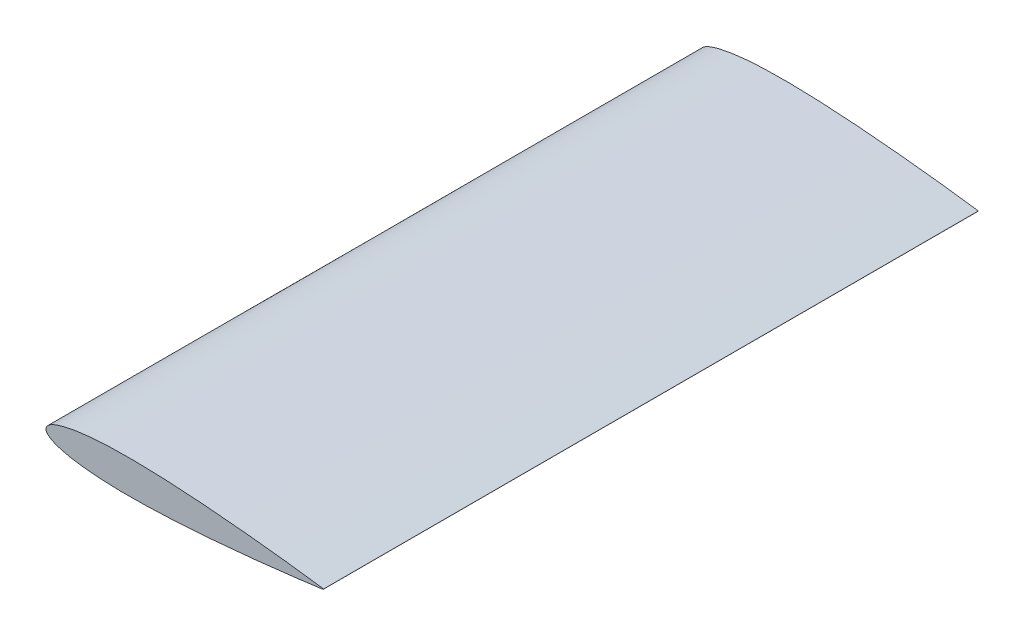
ISO-10303-21;
HEADER;
FILE_DESCRIPTION(('STEP AP214'),'2;1');
FILE_NAME('part.step','',(''),(''),'','','');
FILE_SCHEMA(('AUTOMOTIVE_DESIGN { 1 0 10303 214 1 1 1 1 }'));
ENDSEC;
DATA;
#1=APPLICATION_CONTEXT('core data for automotive mechanical design processes');
#2=APPLICATION_PROTOCOL_DEFINITION('international standard','automotive_design',2000,#1);
#3=PRODUCT_CONTEXT('',#1,'mechanical');
#4=PRODUCT('Part','Part','',(#3));
#5=PRODUCT_RELATED_PRODUCT_CATEGORY('part','',(#4));
#6=PRODUCT_DEFINITION_FORMATION('','',#4);
#7=PRODUCT_DEFINITION_CONTEXT('part definition',#1,'design');
#8=PRODUCT_DEFINITION('design','',#6,#7);
#9=PRODUCT_DEFINITION_SHAPE('','',#8);
#10=(LENGTH_UNIT() NAMED_UNIT(*) SI_UNIT(.MILLI.,.METRE.));
#11=(NAMED_UNIT(*) PLANE_ANGLE_UNIT() SI_UNIT($,.RADIAN.));
#12=(NAMED_UNIT(*) SI_UNIT($,.STERADIAN.) SOLID_ANGLE_UNIT());
#13=UNCERTAINTY_MEASURE_WITH_UNIT(LENGTH_MEASURE(1.E-05),#10,'distance_accuracy_value','');
#14=(GEOMETRIC_REPRESENTATION_CONTEXT(3) GLOBAL_UNCERTAINTY_ASSIGNED_CONTEXT((#13)) GLOBAL_UNIT_ASSIGNED_CONTEXT((#10,
#11,#12)) REPRESENTATION_CONTEXT('',''));
#15=CARTESIAN_POINT('',(0.,0.,0.));
#16=DIRECTION('',(0.,0.,1.));
#17=DIRECTION('',(1.,0.,0.));
#18=AXIS2_PLACEMENT_3D('',#15,#16,#17);
#19=CARTESIAN_POINT('',(-72.4895575679674,12.4916579430229,269.875));
#20=CARTESIAN_POINT('',(-72.4895575679674,12.1631799490064,269.875));
#21=CARTESIAN_POINT('',(-72.3954250237942,11.4893406700684,269.875));
#22=CARTESIAN_POINT('',(-71.9732287690968,10.5126102787401,269.875));
#23=CARTESIAN_POINT('',(-71.2833044842986,9.57257365715759,269.875));
#24=CARTESIAN_POINT('',(-70.3340272758223,8.66515080778666,269.875));
#25=CARTESIAN_POINT('',(-69.1284685897295,7.78715448902189,269.875));
#26=CARTESIAN_POINT('',(-67.6683837824737,6.93774581264716,269.875));
#27=CARTESIAN_POINT('',(-65.9559097036373,6.11788986682478,269.875));
#28=CARTESIAN_POINT('',(-63.9940826032224,5.32944509023976,269.875));
#29=CARTESIAN_POINT('',(-61.7867945135545,4.57475830238824,269.875));
#30=CARTESIAN_POINT('',(-59.3387565999433,3.85635785986425,269.875));
#31=CARTESIAN_POINT('',(-56.6553565640127,3.17695034396704,269.875));
#32=CARTESIAN_POINT('',(-53.7426855672555,2.53900219547483,269.875));
#33=CARTESIAN_POINT('',(-50.6073717613261,1.9451341049457,269.875));
#34=CARTESIAN_POINT('',(-47.2566631082039,1.39750679877092,269.875));
#35=CARTESIAN_POINT('',(-43.6982929093194,0.898367728586359,269.875));
#36=CARTESIAN_POINT('',(-39.9405377250841,0.44940196100295,269.875));
#37=CARTESIAN_POINT('',(-35.9921306676939,0.0522132030337248,269.875));
#38=CARTESIAN_POINT('',(-31.8622786169259,-0.292093371568796,269.875));
#39=CARTESIAN_POINT('',(-27.5606045907713,-0.582721331729668,269.875));
#40=CARTESIAN_POINT('',(-23.0971298056179,-0.819182723469344,269.875));
#41=CARTESIAN_POINT('',(-18.4822758984656,-1.00153037864844,269.875));
#42=CARTESIAN_POINT('',(-13.7268174183502,-1.1301051812941,269.875));
#43=CARTESIAN_POINT('',(-8.8418522389767,-1.20560971573803,269.875));
#44=CARTESIAN_POINT('',(-3.83877739522492,-1.22921281678125,269.875));
#45=CARTESIAN_POINT('',(1.2707219456733,-1.20232588850451,269.875));
#46=CARTESIAN_POINT('',(6.47471549135035,-1.12670718813807,269.875));
#47=CARTESIAN_POINT('',(11.7610520830332,-1.00440567889788,269.875));
#48=CARTESIAN_POINT('',(17.117399344137,-0.837746181545105,269.875));
#49=CARTESIAN_POINT('',(22.5312466579631,-0.629162896081708,269.875));
#50=CARTESIAN_POINT('',(27.989948369281,-0.381339327113552,269.875));
#51=CARTESIAN_POINT('',(33.4807602973594,-0.0970883226520112,269.875));
#52=CARTESIAN_POINT('',(38.9908674308872,0.220726475530346,269.875));
#53=CARTESIAN_POINT('',(44.5074030856521,0.569152493842438,269.875));
#54=CARTESIAN_POINT('',(50.0174841301867,0.945227026758529,269.875));
#55=CARTESIAN_POINT('',(55.5082484798003,1.34599734481427,269.875));
#56=CARTESIAN_POINT('',(60.966870643492,1.76845936690057,269.875));
#57=CARTESIAN_POINT('',(66.3806056488603,2.20978619117466,269.875));
#58=CARTESIAN_POINT('',(71.73680094619,2.66709489859545,269.875));
#59=CARTESIAN_POINT('',(77.022966890695,3.13761381624091,269.875));
#60=CARTESIAN_POINT('',(82.2267422325146,3.61863732712787,269.875));
#61=CARTESIAN_POINT('',(87.3359862787904,4.10746603783953,269.875));
#62=CARTESIAN_POINT('',(92.3387492897865,4.60161240089001,269.875));
#63=CARTESIAN_POINT('',(97.2233704395626,5.09850974509125,269.875));
#64=CARTESIAN_POINT('',(101.978420579536,5.59574213510781,269.875));
#65=CARTESIAN_POINT('',(106.592806112693,6.09086461033472,269.875));
#66=CARTESIAN_POINT('',(111.055740440689,6.58146851328092,269.875));
#67=CARTESIAN_POINT('',(115.356796488438,7.06535562200448,269.875));
#68=CARTESIAN_POINT('',(119.485946028976,7.54006714693968,269.875));
#69=CARTESIAN_POINT('',(123.433537168402,8.00339554541148,269.875));
#70=CARTESIAN_POINT('',(127.190349685259,8.45306443030988,269.875));
#71=CARTESIAN_POINT('',(130.747598759962,8.88685815975099,269.875));
#72=CARTESIAN_POINT('',(134.096991184743,9.30250286390473,269.875));
#73=CARTESIAN_POINT('',(137.230695420591,9.69790302694453,269.875));
#74=CARTESIAN_POINT('',(140.141398454237,10.0708470797437,269.875));
#75=CARTESIAN_POINT('',(142.822290249236,10.4194168887949,269.875));
#76=CARTESIAN_POINT('',(145.267118152254,10.7414893081718,269.875));
#77=CARTESIAN_POINT('',(147.470194704161,11.0352743430091,269.875));
#78=CARTESIAN_POINT('',(149.426288025842,11.299112749374,269.875));
#79=CARTESIAN_POINT('',(151.131108503296,11.5308673214838,269.875));
#80=CARTESIAN_POINT('',(152.579838285708,11.7307823466118,269.875));
#81=CARTESIAN_POINT('',(153.771480414837,11.8926741562028,269.875));
#82=CARTESIAN_POINT('',(154.69687642952,12.0287252392023,269.875));
#83=CARTESIAN_POINT('',(155.369349102873,12.1059141280244,269.875));
#84=CARTESIAN_POINT('',(155.755667825148,12.1894433999598,269.875));
#85=CARTESIAN_POINT('',(156.151924325214,12.1818945605116,269.875));
#86=CARTESIAN_POINT('',(156.151924325213,12.8014213255342,269.875));
#87=CARTESIAN_POINT('',(155.755667825148,12.793872486086,269.875));
#88=CARTESIAN_POINT('',(155.369349102873,12.8774017580214,269.875));
#89=CARTESIAN_POINT('',(154.69687642952,12.9545906468436,269.875));
#90=CARTESIAN_POINT('',(153.771480414837,13.0906417298431,269.875));
#91=CARTESIAN_POINT('',(152.579838285709,13.252533539434,269.875));
#92=CARTESIAN_POINT('',(151.131108503296,13.452448564562,269.875));
#93=CARTESIAN_POINT('',(149.426288025842,13.6842031366718,269.875));
#94=CARTESIAN_POINT('',(147.470194704161,13.9480415430367,269.875));
#95=CARTESIAN_POINT('',(145.267118152254,14.241826577874,269.875));
#96=CARTESIAN_POINT('',(142.822290249236,14.5638989972509,269.875));
#97=CARTESIAN_POINT('',(140.141398454237,14.9124688063022,269.875));
#98=CARTESIAN_POINT('',(137.230695420591,15.2854128591013,269.875));
#99=CARTESIAN_POINT('',(134.096991184743,15.6808130221411,269.875));
#100=CARTESIAN_POINT('',(130.747598759962,16.0964577262948,269.875));
#101=CARTESIAN_POINT('',(127.190349685259,16.530251455736,269.875));
#102=CARTESIAN_POINT('',(123.433537168402,16.9799203406344,269.875));
#103=CARTESIAN_POINT('',(119.485946028976,17.4432487391061,269.875));
#104=CARTESIAN_POINT('',(115.356796488438,17.9179602640414,269.875));
#105=CARTESIAN_POINT('',(111.055740440688,18.4018473727649,269.875));
#106=CARTESIAN_POINT('',(106.592806112694,18.8924512757111,269.875));
#107=CARTESIAN_POINT('',(101.978420579536,19.387573750938,269.875));
#108=CARTESIAN_POINT('',(97.2233704395625,19.8848061409546,269.875));
#109=CARTESIAN_POINT('',(92.3387492897866,20.3817034851558,269.875));
#110=CARTESIAN_POINT('',(87.3359862787904,20.8758498482063,269.875));
#111=CARTESIAN_POINT('',(82.2267422325146,21.364678558918,269.875));
#112=CARTESIAN_POINT('',(77.022966890695,21.8457020698049,269.875));
#113=CARTESIAN_POINT('',(71.73680094619,22.3162209874504,269.875));
#114=CARTESIAN_POINT('',(66.3806056488603,22.7735296948712,269.875));
#115=CARTESIAN_POINT('',(60.9668706434919,23.2148565191453,269.875));
#116=CARTESIAN_POINT('',(55.5082484798003,23.6373185412316,269.875));
#117=CARTESIAN_POINT('',(50.0174841301867,24.0380888592873,269.875));
#118=CARTESIAN_POINT('',(44.5074030856521,24.4141633922034,269.875));
#119=CARTESIAN_POINT('',(38.9908674308871,24.7625894105155,269.875));
#120=CARTESIAN_POINT('',(33.4807602973595,25.0804042086978,269.875));
#121=CARTESIAN_POINT('',(27.9899483692809,25.3646552131594,269.875));
#122=CARTESIAN_POINT('',(22.5312466579631,25.6124787821275,269.875));
#123=CARTESIAN_POINT('',(17.117399344137,25.8210620675909,269.875));
#124=CARTESIAN_POINT('',(11.7610520830332,25.9877215649437,269.875));
#125=CARTESIAN_POINT('',(6.47471549135035,26.1100230741839,269.875));
#126=CARTESIAN_POINT('',(1.27072194567333,26.1856417745503,269.875));
#127=CARTESIAN_POINT('',(-3.83877739522493,26.2125287028271,269.875));
#128=CARTESIAN_POINT('',(-8.84185223897671,26.1889256017839,269.875));
#129=CARTESIAN_POINT('',(-13.7268174183502,26.1134210673399,269.875));
#130=CARTESIAN_POINT('',(-18.4822758984657,25.9848462646943,269.875));
#131=CARTESIAN_POINT('',(-23.0971298056178,25.8024986095152,269.875));
#132=CARTESIAN_POINT('',(-27.5606045907713,25.5660372177755,269.875));
#133=CARTESIAN_POINT('',(-31.8622786169259,25.2754092576146,269.875));
#134=CARTESIAN_POINT('',(-35.9921306676939,24.9311026830121,269.875));
#135=CARTESIAN_POINT('',(-39.9405377250841,24.5339139250429,269.875));
#136=CARTESIAN_POINT('',(-43.6982929093194,24.0849481574595,269.875));
#137=CARTESIAN_POINT('',(-47.2566631082038,23.5858090872749,269.875));
#138=CARTESIAN_POINT('',(-50.6073717613261,23.0381817811001,269.875));
#139=CARTESIAN_POINT('',(-53.7426855672555,22.444313690571,269.875));
#140=CARTESIAN_POINT('',(-56.6553565640127,21.8063655420788,269.875));
#141=CARTESIAN_POINT('',(-59.3387565999433,21.1269580261816,269.875));
#142=CARTESIAN_POINT('',(-61.7867945135545,20.4085575836576,269.875));
#143=CARTESIAN_POINT('',(-63.9940826032224,19.6538707958061,269.875));
#144=CARTESIAN_POINT('',(-65.9559097036373,18.865426019221,269.875));
#145=CARTESIAN_POINT('',(-67.6683837824737,18.0455700733987,269.875));
#146=CARTESIAN_POINT('',(-69.1284685897295,17.1961613970239,269.875));
#147=CARTESIAN_POINT('',(-70.3340272758223,16.3181650782592,269.875));
#148=CARTESIAN_POINT('',(-71.2833044842987,15.4107422288882,269.875));
#149=CARTESIAN_POINT('',(-71.9732287690968,14.4707056073057,269.875));
#150=CARTESIAN_POINT('',(-72.3954250237942,13.4939752159774,269.875));
#151=CARTESIAN_POINT('',(-72.4895575679674,12.8201359370394,269.875));
#152=CARTESIAN_POINT('',(-72.4895575679674,12.4916579430229,269.875));
#153=B_SPLINE_CURVE_WITH_KNOTS('',3,(#19,#20,#21,#22,#23,#24,#25,#26,#27,#28,#29,#30,#31,#32,
#33,#34,#35,#36,#37,#38,#39,#40,#41,#42,#43,#44,#45,#46,#47,#48,#49,#50,#51,#52,#53,#54,#55,#56,
#57,#58,#59,#60,#61,#62,#63,#64,#65,#66,#67,#68,#69,#70,#71,#72,#73,#74,#75,#76,#77,#78,#79,#80,
#81,#82,#83,#84,#85,#86,#87,#88,#89,#90,#91,#92,#93,#94,#95,#96,#97,#98,#99,#100,#101,#102,#103,
#104,#105,#106,#107,#108,#109,#110,#111,#112,#113,#114,#115,#116,#117,#118,#119,#120,#121,#122,
#123,#124,#125,#126,#127,#128,#129,#130,#131,#132,#133,#134,#135,#136,#137,#138,#139,#140,#141,
#142,#143,#144,#145,#146,#147,#148,#149,#150,#151,#152),.UNSPECIFIED.,.T.,.F.,(4,1,1,1,1,1,1,1,
1,1,1,1,1,1,1,1,1,1,1,1,1,1,1,1,1,1,1,1,1,1,1,1,1,1,1,1,1,1,1,1,1,1,1,1,1,1,1,1,1,1,1,1,1,1,1,1,
1,1,1,1,1,1,1,1,1,1,1,1,1,1,1,1,1,1,1,1,1,1,1,1,1,1,1,1,1,1,1,1,1,1,1,1,1,1,1,1,1,1,1,1,1,1,1,1,
1,1,1,1,1,1,1,1,1,1,1,1,1,1,1,1,1,1,1,1,1,1,1,1,1,1,1,4),(0.,0.00210616807074115,
0.00432059011551111,0.00677278324255004,0.0095566969740557,0.0127340412762951,0.016342887665016,
0.0204056041416188,0.0249341021959062,0.0299330711387399,0.0354022405625184,0.0413374297387623,
0.0477315899593609,0.0545753893368606,0.0618574049639954,0.0695645708943233,0.0776823107915671,
0.0861946839628209,0.0950844406286816,0.104333244082668,0.11392170016525,0.123829338817381,
0.134034707587743,0.144515530837606,0.155248716244455,0.166210355911424,0.177375782785101,
0.188719821086083,0.200216647190567,0.211839950659802,0.223562989450439,0.235358652726913,
0.247199624742581,0.259058395239763,0.270907226000352,0.28271845684065,0.294464514017973,
0.306117689175103,0.317650770640405,0.329036618137891,0.340248510387813,0.351259999107984,
0.362045273287995,0.372578891011839,0.382836142378724,0.392792739452293,0.402425320157517,
0.411711114815343,0.420628244391039,0.429155672678663,0.437273179489273,0.444961560956889,
0.452202574975458,0.458979062595132,0.465274875652064,0.471074962819879,0.4763655692602,
0.481133960582339,0.485368767772863,0.489059784178549,0.492198147958178,0.494776266124308,
0.496788010026555,0.49822842540793,0.499094072926926,0.499382862053181,0.500617137946819,
0.500905927073075,0.50177157459207,0.503211989973446,0.505223733875692,0.507801852041822,
0.510940215821451,0.514631232227138,0.518866039417661,0.5236344307398,0.528925037180122,
0.534725124347937,0.541020937404868,0.547797425024542,0.555038439043111,0.562726820510727,
0.570844327321338,0.579371755608962,0.588288885184657,0.597574679842483,0.607207260547707,
0.617163857621276,0.627421108988161,0.637954726712006,0.648740000892016,0.659751489612187,
0.670963381862109,0.682349229359595,0.693882310824897,0.705535485982027,0.717281543159351,
0.729092773999648,0.740941604760238,0.752800375257419,0.764641347273087,0.776437010549561,
0.788160049340198,0.799783352809433,0.811280178913917,0.822624217214899,0.833789644088576,
0.844751283755546,0.855484469162394,0.865965292412258,0.876170661182619,0.88607829983475,
0.895666755917333,0.904915559371319,0.913805316037179,0.922317689208433,0.930435429105677,
0.938142595036005,0.94542461066314,0.952268410040639,0.958662570261238,0.964597759437482,
0.97006692886126,0.975065897804094,0.979594395858381,0.983657112334984,0.987265958723705,
0.990443303025944,0.99322721675745,0.995679409884489,0.997893831929259,1.),.UNSPECIFIED.);
#154=DIRECTION('',(0.,0.,-1.));
#155=VECTOR('',#154,1.);
#156=SURFACE_OF_LINEAR_EXTRUSION('',#153,#155);
#157=CARTESIAN_POINT('',(-72.4895575679674,12.4916579430229,269.875));
#158=VERTEX_POINT('',#157);
#159=EDGE_CURVE('E10',#158,#158,#153,.T.);
#160=ORIENTED_EDGE('',*,*,#159,.F.);
#161=EDGE_LOOP('',(#160));
#162=FACE_BOUND('',#161,.T.);
#163=CARTESIAN_POINT('',(-72.4895575679674,12.4916579430229,-269.875));
#164=CARTESIAN_POINT('',(-72.4895575679674,12.1631799490064,-269.875));
#165=CARTESIAN_POINT('',(-72.3954250237942,11.4893406700684,-269.875));
#166=CARTESIAN_POINT('',(-71.9732287690968,10.5126102787401,-269.875));
#167=CARTESIAN_POINT('',(-71.2833044842986,9.57257365715759,-269.875));
#168=CARTESIAN_POINT('',(-70.3340272758223,8.66515080778666,-269.875));
#169=CARTESIAN_POINT('',(-69.1284685897295,7.78715448902189,-269.875));
#170=CARTESIAN_POINT('',(-67.6683837824737,6.93774581264716,-269.875));
#171=CARTESIAN_POINT('',(-65.9559097036373,6.11788986682478,-269.875));
#172=CARTESIAN_POINT('',(-63.9940826032224,5.32944509023976,-269.875));
#173=CARTESIAN_POINT('',(-61.7867945135545,4.57475830238824,-269.875));
#174=CARTESIAN_POINT('',(-59.3387565999433,3.85635785986425,-269.875));
#175=CARTESIAN_POINT('',(-56.6553565640127,3.17695034396704,-269.875));
#176=CARTESIAN_POINT('',(-53.7426855672555,2.53900219547483,-269.875));
#177=CARTESIAN_POINT('',(-50.6073717613261,1.9451341049457,-269.875));
#178=CARTESIAN_POINT('',(-47.2566631082039,1.39750679877092,-269.875));
#179=CARTESIAN_POINT('',(-43.6982929093194,0.898367728586359,-269.875));
#180=CARTESIAN_POINT('',(-39.9405377250841,0.44940196100295,-269.875));
#181=CARTESIAN_POINT('',(-35.9921306676939,0.0522132030337248,-269.875));
#182=CARTESIAN_POINT('',(-31.8622786169259,-0.292093371568796,-269.875));
#183=CARTESIAN_POINT('',(-27.5606045907713,-0.582721331729668,-269.875));
#184=CARTESIAN_POINT('',(-23.0971298056179,-0.819182723469344,-269.875));
#185=CARTESIAN_POINT('',(-18.4822758984656,-1.00153037864844,-269.875));
#186=CARTESIAN_POINT('',(-13.7268174183502,-1.1301051812941,-269.875));
#187=CARTESIAN_POINT('',(-8.8418522389767,-1.20560971573803,-269.875));
#188=CARTESIAN_POINT('',(-3.83877739522492,-1.22921281678125,-269.875));
#189=CARTESIAN_POINT('',(1.2707219456733,-1.20232588850451,-269.875));
#190=CARTESIAN_POINT('',(6.47471549135035,-1.12670718813807,-269.875));
#191=CARTESIAN_POINT('',(11.7610520830332,-1.00440567889788,-269.875));
#192=CARTESIAN_POINT('',(17.117399344137,-0.837746181545105,-269.875));
#193=CARTESIAN_POINT('',(22.5312466579631,-0.629162896081708,-269.875));
#194=CARTESIAN_POINT('',(27.989948369281,-0.381339327113552,-269.875));
#195=CARTESIAN_POINT('',(33.4807602973594,-0.0970883226520112,-269.875));
#196=CARTESIAN_POINT('',(38.9908674308872,0.220726475530346,-269.875));
#197=CARTESIAN_POINT('',(44.5074030856521,0.569152493842438,-269.875));
#198=CARTESIAN_POINT('',(50.0174841301867,0.945227026758529,-269.875));
#199=CARTESIAN_POINT('',(55.5082484798003,1.34599734481427,-269.875));
#200=CARTESIAN_POINT('',(60.966870643492,1.76845936690057,-269.875));
#201=CARTESIAN_POINT('',(66.3806056488603,2.20978619117466,-269.875));
#202=CARTESIAN_POINT('',(71.73680094619,2.66709489859545,-269.875));
#203=CARTESIAN_POINT('',(77.022966890695,3.13761381624091,-269.875));
#204=CARTESIAN_POINT('',(82.2267422325146,3.61863732712787,-269.875));
#205=CARTESIAN_POINT('',(87.3359862787904,4.10746603783953,-269.875));
#206=CARTESIAN_POINT('',(92.3387492897865,4.60161240089001,-269.875));
#207=CARTESIAN_POINT('',(97.2233704395626,5.09850974509125,-269.875));
#208=CARTESIAN_POINT('',(101.978420579536,5.59574213510781,-269.875));
#209=CARTESIAN_POINT('',(106.592806112693,6.09086461033472,-269.875));
#210=CARTESIAN_POINT('',(111.055740440689,6.58146851328092,-269.875));
#211=CARTESIAN_POINT('',(115.356796488438,7.06535562200448,-269.875));
#212=CARTESIAN_POINT('',(119.485946028976,7.54006714693968,-269.875));
#213=CARTESIAN_POINT('',(123.433537168402,8.00339554541148,-269.875));
#214=CARTESIAN_POINT('',(127.190349685259,8.45306443030988,-269.875));
#215=CARTESIAN_POINT('',(130.747598759962,8.88685815975099,-269.875));
#216=CARTESIAN_POINT('',(134.096991184743,9.30250286390473,-269.875));
#217=CARTESIAN_POINT('',(137.230695420591,9.69790302694453,-269.875));
#218=CARTESIAN_POINT('',(140.141398454237,10.0708470797437,-269.875));
#219=CARTESIAN_POINT('',(142.822290249236,10.4194168887949,-269.875));
#220=CARTESIAN_POINT('',(145.267118152254,10.7414893081718,-269.875));
#221=CARTESIAN_POINT('',(147.470194704161,11.0352743430091,-269.875));
#222=CARTESIAN_POINT('',(149.426288025842,11.299112749374,-269.875));
#223=CARTESIAN_POINT('',(151.131108503296,11.5308673214838,-269.875));
#224=CARTESIAN_POINT('',(152.579838285708,11.7307823466118,-269.875));
#225=CARTESIAN_POINT('',(153.771480414837,11.8926741562028,-269.875));
#226=CARTESIAN_POINT('',(154.69687642952,12.0287252392023,-269.875));
#227=CARTESIAN_POINT('',(155.369349102873,12.1059141280244,-269.875));
#228=CARTESIAN_POINT('',(155.755667825148,12.1894433999598,-269.875));
#229=CARTESIAN_POINT('',(156.151924325214,12.1818945605116,-269.875));
#230=CARTESIAN_POINT('',(156.151924325213,12.8014213255342,-269.875));
#231=CARTESIAN_POINT('',(155.755667825148,12.793872486086,-269.875));
#232=CARTESIAN_POINT('',(155.369349102873,12.8774017580214,-269.875));
#233=CARTESIAN_POINT('',(154.69687642952,12.9545906468436,-269.875));
#234=CARTESIAN_POINT('',(153.771480414837,13.0906417298431,-269.875));
#235=CARTESIAN_POINT('',(152.579838285709,13.252533539434,-269.875));
#236=CARTESIAN_POINT('',(151.131108503296,13.452448564562,-269.875));
#237=CARTESIAN_POINT('',(149.426288025842,13.6842031366718,-269.875));
#238=CARTESIAN_POINT('',(147.470194704161,13.9480415430367,-269.875));
#239=CARTESIAN_POINT('',(145.267118152254,14.241826577874,-269.875));
#240=CARTESIAN_POINT('',(142.822290249236,14.5638989972509,-269.875));
#241=CARTESIAN_POINT('',(140.141398454237,14.9124688063022,-269.875));
#242=CARTESIAN_POINT('',(137.230695420591,15.2854128591013,-269.875));
#243=CARTESIAN_POINT('',(134.096991184743,15.6808130221411,-269.875));
#244=CARTESIAN_POINT('',(130.747598759962,16.0964577262948,-269.875));
#245=CARTESIAN_POINT('',(127.190349685259,16.530251455736,-269.875));
#246=CARTESIAN_POINT('',(123.433537168402,16.9799203406344,-269.875));
#247=CARTESIAN_POINT('',(119.485946028976,17.4432487391061,-269.875));
#248=CARTESIAN_POINT('',(115.356796488438,17.9179602640414,-269.875));
#249=CARTESIAN_POINT('',(111.055740440688,18.4018473727649,-269.875));
#250=CARTESIAN_POINT('',(106.592806112694,18.8924512757111,-269.875));
#251=CARTESIAN_POINT('',(101.978420579536,19.387573750938,-269.875));
#252=CARTESIAN_POINT('',(97.2233704395625,19.8848061409546,-269.875));
#253=CARTESIAN_POINT('',(92.3387492897866,20.3817034851558,-269.875));
#254=CARTESIAN_POINT('',(87.3359862787904,20.8758498482063,-269.875));
#255=CARTESIAN_POINT('',(82.2267422325146,21.364678558918,-269.875));
#256=CARTESIAN_POINT('',(77.022966890695,21.8457020698049,-269.875));
#257=CARTESIAN_POINT('',(71.73680094619,22.3162209874504,-269.875));
#258=CARTESIAN_POINT('',(66.3806056488603,22.7735296948712,-269.875));
#259=CARTESIAN_POINT('',(60.9668706434919,23.2148565191453,-269.875));
#260=CARTESIAN_POINT('',(55.5082484798003,23.6373185412316,-269.875));
#261=CARTESIAN_POINT('',(50.0174841301867,24.0380888592873,-269.875));
#262=CARTESIAN_POINT('',(44.5074030856521,24.4141633922034,-269.875));
#263=CARTESIAN_POINT('',(38.9908674308871,24.7625894105155,-269.875));
#264=CARTESIAN_POINT('',(33.4807602973595,25.0804042086978,-269.875));
#265=CARTESIAN_POINT('',(27.9899483692809,25.3646552131594,-269.875));
#266=CARTESIAN_POINT('',(22.5312466579631,25.6124787821275,-269.875));
#267=CARTESIAN_POINT('',(17.117399344137,25.8210620675909,-269.875));
#268=CARTESIAN_POINT('',(11.7610520830332,25.9877215649437,-269.875));
#269=CARTESIAN_POINT('',(6.47471549135035,26.1100230741839,-269.875));
#270=CARTESIAN_POINT('',(1.27072194567333,26.1856417745503,-269.875));
#271=CARTESIAN_POINT('',(-3.83877739522493,26.2125287028271,-269.875));
#272=CARTESIAN_POINT('',(-8.84185223897671,26.1889256017839,-269.875));
#273=CARTESIAN_POINT('',(-13.7268174183502,26.1134210673399,-269.875));
#274=CARTESIAN_POINT('',(-18.4822758984657,25.9848462646943,-269.875));
#275=CARTESIAN_POINT('',(-23.0971298056178,25.8024986095152,-269.875));
#276=CARTESIAN_POINT('',(-27.5606045907713,25.5660372177755,-269.875));
#277=CARTESIAN_POINT('',(-31.8622786169259,25.2754092576146,-269.875));
#278=CARTESIAN_POINT('',(-35.9921306676939,24.9311026830121,-269.875));
#279=CARTESIAN_POINT('',(-39.9405377250841,24.5339139250429,-269.875));
#280=CARTESIAN_POINT('',(-43.6982929093194,24.0849481574595,-269.875));
#281=CARTESIAN_POINT('',(-47.2566631082038,23.5858090872749,-269.875));
#282=CARTESIAN_POINT('',(-50.6073717613261,23.0381817811001,-269.875));
#283=CARTESIAN_POINT('',(-53.7426855672555,22.444313690571,-269.875));
#284=CARTESIAN_POINT('',(-56.6553565640127,21.8063655420788,-269.875));
#285=CARTESIAN_POINT('',(-59.3387565999433,21.1269580261816,-269.875));
#286=CARTESIAN_POINT('',(-61.7867945135545,20.4085575836576,-269.875));
#287=CARTESIAN_POINT('',(-63.9940826032224,19.6538707958061,-269.875));
#288=CARTESIAN_POINT('',(-65.9559097036373,18.865426019221,-269.875));
#289=CARTESIAN_POINT('',(-67.6683837824737,18.0455700733987,-269.875));
#290=CARTESIAN_POINT('',(-69.1284685897295,17.1961613970239,-269.875));
#291=CARTESIAN_POINT('',(-70.3340272758223,16.3181650782592,-269.875));
#292=CARTESIAN_POINT('',(-71.2833044842987,15.4107422288882,-269.875));
#293=CARTESIAN_POINT('',(-71.9732287690968,14.4707056073057,-269.875));
#294=CARTESIAN_POINT('',(-72.3954250237942,13.4939752159774,-269.875));
#295=CARTESIAN_POINT('',(-72.4895575679674,12.8201359370394,-269.875));
#296=CARTESIAN_POINT('',(-72.4895575679674,12.4916579430229,-269.875));
#297=B_SPLINE_CURVE_WITH_KNOTS('',3,(#163,#164,#165,#166,#167,#168,#169,#170,#171,#172,#173,
#174,#175,#176,#177,#178,#179,#180,#181,#182,#183,#184,#185,#186,#187,#188,#189,#190,#191,#192,
#193,#194,#195,#196,#197,#198,#199,#200,#201,#202,#203,#204,#205,#206,#207,#208,#209,#210,#211,
#212,#213,#214,#215,#216,#217,#218,#219,#220,#221,#222,#223,#224,#225,#226,#227,#228,#229,#230,
#231,#232,#233,#234,#235,#236,#237,#238,#239,#240,#241,#242,#243,#244,#245,#246,#247,#248,#249,
#250,#251,#252,#253,#254,#255,#256,#257,#258,#259,#260,#261,#262,#263,#264,#265,#266,#267,#268,
#269,#270,#271,#272,#273,#274,#275,#276,#277,#278,#279,#280,#281,#282,#283,#284,#285,#286,#287,
#288,#289,#290,#291,#292,#293,#294,#295,#296),.UNSPECIFIED.,.T.,.F.,(4,1,1,1,1,1,1,1,1,1,1,1,1,
1,1,1,1,1,1,1,1,1,1,1,1,1,1,1,1,1,1,1,1,1,1,1,1,1,1,1,1,1,1,1,1,1,1,1,1,1,1,1,1,1,1,1,1,1,1,1,1,
1,1,1,1,1,1,1,1,1,1,1,1,1,1,1,1,1,1,1,1,1,1,1,1,1,1,1,1,1,1,1,1,1,1,1,1,1,1,1,1,1,1,1,1,1,1,1,1,
1,1,1,1,1,1,1,1,1,1,1,1,1,1,1,1,1,1,1,1,1,1,4),(0.,0.00210616807074115,0.00432059011551111,
0.00677278324255004,0.0095566969740557,0.0127340412762951,0.016342887665016,0.0204056041416188,
0.0249341021959062,0.0299330711387399,0.0354022405625184,0.0413374297387623,0.0477315899593609,
0.0545753893368606,0.0618574049639954,0.0695645708943233,0.0776823107915671,0.0861946839628209,
0.0950844406286816,0.104333244082668,0.11392170016525,0.123829338817381,0.134034707587743,
0.144515530837606,0.155248716244455,0.166210355911424,0.177375782785101,0.188719821086083,
0.200216647190567,0.211839950659802,0.223562989450439,0.235358652726913,0.247199624742581,
0.259058395239763,0.270907226000352,0.28271845684065,0.294464514017973,0.306117689175103,
0.317650770640405,0.329036618137891,0.340248510387813,0.351259999107984,0.362045273287995,
0.372578891011839,0.382836142378724,0.392792739452293,0.402425320157517,0.411711114815343,
0.420628244391039,0.429155672678663,0.437273179489273,0.444961560956889,0.452202574975458,
0.458979062595132,0.465274875652064,0.471074962819879,0.4763655692602,0.481133960582339,
0.485368767772863,0.489059784178549,0.492198147958178,0.494776266124308,0.496788010026555,
0.49822842540793,0.499094072926926,0.499382862053181,0.500617137946819,0.500905927073075,
0.50177157459207,0.503211989973446,0.505223733875692,0.507801852041822,0.510940215821451,
0.514631232227138,0.518866039417661,0.5236344307398,0.528925037180122,0.534725124347937,
0.541020937404868,0.547797425024542,0.555038439043111,0.562726820510727,0.570844327321338,
0.579371755608962,0.588288885184657,0.597574679842483,0.607207260547707,0.617163857621276,
0.627421108988161,0.637954726712006,0.648740000892016,0.659751489612187,0.670963381862109,
0.682349229359595,0.693882310824897,0.705535485982027,0.717281543159351,0.729092773999648,
0.740941604760238,0.752800375257419,0.764641347273087,0.776437010549561,0.788160049340198,
0.799783352809433,0.811280178913917,0.822624217214899,0.833789644088576,0.844751283755546,
0.855484469162394,0.865965292412258,0.876170661182619,0.88607829983475,0.895666755917333,
0.904915559371319,0.913805316037179,0.922317689208433,0.930435429105677,0.938142595036005,
0.94542461066314,0.952268410040639,0.958662570261238,0.964597759437482,0.97006692886126,
0.975065897804094,0.979594395858381,0.983657112334984,0.987265958723705,0.990443303025944,
0.99322721675745,0.995679409884489,0.997893831929259,1.),.UNSPECIFIED.);
#298=CARTESIAN_POINT('',(-72.4895575679674,12.4916579430229,-269.875));
#299=VERTEX_POINT('',#298);
#300=EDGE_CURVE('E49',#299,#299,#297,.T.);
#301=ORIENTED_EDGE('',*,*,#300,.T.);
#302=EDGE_LOOP('',(#301));
#303=FACE_BOUND('',#302,.T.);
#304=ADVANCED_FACE('F39',(#162,#303),#156,.F.);
#305=CARTESIAN_POINT('',(156.110442432033,12.4916579430228,269.875));
#306=DIRECTION('',(0.,0.,-1.));
#307=DIRECTION('',(-1.,0.,0.));
#308=AXIS2_PLACEMENT_3D('',#305,#306,#307);
#309=PLANE('',#308);
#310=ORIENTED_EDGE('',*,*,#159,.T.);
#311=EDGE_LOOP('',(#310));
#312=FACE_BOUND('',#311,.T.);
#313=ADVANCED_FACE('F64',(#312),#309,.F.);
#314=CARTESIAN_POINT('',(156.110442432033,12.4916579430228,-269.875));
#315=DIRECTION('',(0.,0.,-1.));
#316=DIRECTION('',(-1.,0.,0.));
#317=AXIS2_PLACEMENT_3D('',#314,#315,#316);
#318=PLANE('',#317);
#319=ORIENTED_EDGE('',*,*,#300,.F.);
#320=EDGE_LOOP('',(#319));
#321=FACE_BOUND('',#320,.T.);
#322=ADVANCED_FACE('F62',(#321),#318,.T.);
#323=CLOSED_SHELL('',(#304,#313,#322));
#324=MANIFOLD_SOLID_BREP('B2',#323);
#325=ADVANCED_BREP_SHAPE_REPRESENTATION('',(#18,#324),#14);
#326=SHAPE_DEFINITION_REPRESENTATION(#9,#325);
ENDSEC;
END-ISO-10303-21;
